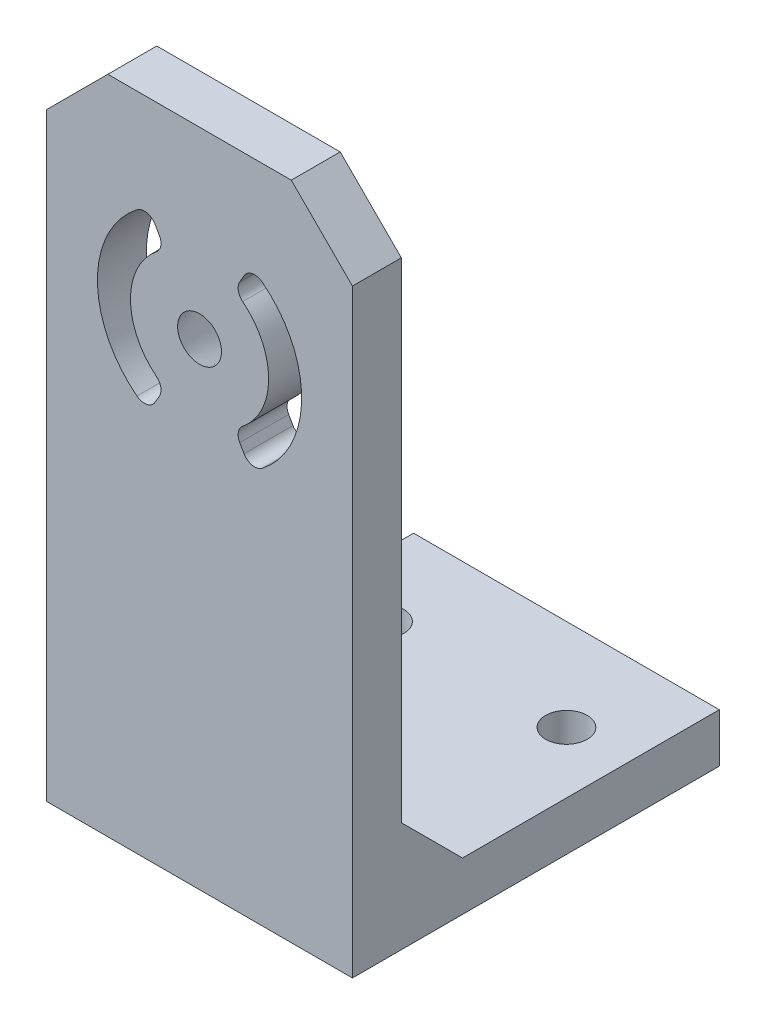
ISO-10303-21;
HEADER;
FILE_DESCRIPTION(('STEP AP214'),'2;1');
FILE_NAME('part.step','',(''),(''),'','','');
FILE_SCHEMA(('AUTOMOTIVE_DESIGN { 1 0 10303 214 1 1 1 1 }'));
ENDSEC;
DATA;
#1=APPLICATION_CONTEXT('core data for automotive mechanical design processes');
#2=APPLICATION_PROTOCOL_DEFINITION('international standard','automotive_design',2000,#1);
#3=PRODUCT_CONTEXT('',#1,'mechanical');
#4=PRODUCT('Part','Part','',(#3));
#5=PRODUCT_RELATED_PRODUCT_CATEGORY('part','',(#4));
#6=PRODUCT_DEFINITION_FORMATION('','',#4);
#7=PRODUCT_DEFINITION_CONTEXT('part definition',#1,'design');
#8=PRODUCT_DEFINITION('design','',#6,#7);
#9=PRODUCT_DEFINITION_SHAPE('','',#8);
#10=(LENGTH_UNIT() NAMED_UNIT(*) SI_UNIT(.MILLI.,.METRE.));
#11=(NAMED_UNIT(*) PLANE_ANGLE_UNIT() SI_UNIT($,.RADIAN.));
#12=(NAMED_UNIT(*) SI_UNIT($,.STERADIAN.) SOLID_ANGLE_UNIT());
#13=UNCERTAINTY_MEASURE_WITH_UNIT(LENGTH_MEASURE(1.E-05),#10,'distance_accuracy_value','');
#14=(GEOMETRIC_REPRESENTATION_CONTEXT(3) GLOBAL_UNCERTAINTY_ASSIGNED_CONTEXT((#13)) GLOBAL_UNIT_ASSIGNED_CONTEXT((#10,
#11,#12)) REPRESENTATION_CONTEXT('',''));
#15=CARTESIAN_POINT('',(0.,0.,0.));
#16=DIRECTION('',(0.,0.,1.));
#17=DIRECTION('',(1.,0.,0.));
#18=AXIS2_PLACEMENT_3D('',#15,#16,#17);
#19=CARTESIAN_POINT('',(0.,4.,0.));
#20=DIRECTION('',(0.,-1.,0.));
#21=DIRECTION('',(0.,0.,-1.));
#22=AXIS2_PLACEMENT_3D('',#19,#20,#21);
#23=PLANE('',#22);
#24=CARTESIAN_POINT('',(20.,4.,-22.5));
#25=DIRECTION('',(0.,1.,0.));
#26=DIRECTION('',(0.,0.,1.));
#27=AXIS2_PLACEMENT_3D('',#24,#25,#26);
#28=CIRCLE('',#27,1.7);
#29=CARTESIAN_POINT('',(20.,4.,-20.8));
#30=VERTEX_POINT('',#29);
#31=EDGE_CURVE('E457',#30,#30,#28,.T.);
#32=ORIENTED_EDGE('',*,*,#31,.F.);
#33=EDGE_LOOP('',(#32));
#34=FACE_BOUND('',#33,.T.);
#35=CARTESIAN_POINT('',(5.,4.,-22.5));
#36=DIRECTION('',(0.,1.,0.));
#37=DIRECTION('',(0.,0.,1.));
#38=AXIS2_PLACEMENT_3D('',#35,#36,#37);
#39=CIRCLE('',#38,1.7);
#40=CARTESIAN_POINT('',(5.,4.,-20.8));
#41=VERTEX_POINT('',#40);
#42=EDGE_CURVE('E253',#41,#41,#39,.T.);
#43=ORIENTED_EDGE('',*,*,#42,.F.);
#44=EDGE_LOOP('',(#43));
#45=FACE_BOUND('',#44,.T.);
#46=DIRECTION('',(0.,0.,1.));
#47=VECTOR('',#46,1.);
#48=CARTESIAN_POINT('',(0.,4.,0.));
#49=LINE('',#48,#47);
#50=CARTESIAN_POINT('',(0.,4.,-30.));
#51=VERTEX_POINT('',#50);
#52=CARTESIAN_POINT('',(0.,4.,-9.));
#53=VERTEX_POINT('',#52);
#54=EDGE_CURVE('E225',#51,#53,#49,.T.);
#55=ORIENTED_EDGE('',*,*,#54,.T.);
#56=DIRECTION('',(-1.,0.,0.));
#57=VECTOR('',#56,1.);
#58=CARTESIAN_POINT('',(32.0710678118655,4.,-9.));
#59=LINE('',#58,#57);
#60=CARTESIAN_POINT('',(25.,4.,-9.));
#61=VERTEX_POINT('',#60);
#62=EDGE_CURVE('E220',#61,#53,#59,.T.);
#63=ORIENTED_EDGE('',*,*,#62,.F.);
#64=DIRECTION('',(0.,0.,-1.));
#65=VECTOR('',#64,1.);
#66=CARTESIAN_POINT('',(25.,4.,0.));
#67=LINE('',#66,#65);
#68=CARTESIAN_POINT('',(25.,4.,-30.));
#69=VERTEX_POINT('',#68);
#70=EDGE_CURVE('E214',#61,#69,#67,.T.);
#71=ORIENTED_EDGE('',*,*,#70,.T.);
#72=DIRECTION('',(-1.,0.,0.));
#73=VECTOR('',#72,1.);
#74=CARTESIAN_POINT('',(0.,4.,-30.));
#75=LINE('',#74,#73);
#76=EDGE_CURVE('E217',#69,#51,#75,.T.);
#77=ORIENTED_EDGE('',*,*,#76,.T.);
#78=EDGE_LOOP('',(#55,#63,#71,#77));
#79=FACE_BOUND('',#78,.T.);
#80=ADVANCED_FACE('F47',(#34,#45,#79),#23,.F.);
#81=CARTESIAN_POINT('',(0.,0.,0.));
#82=DIRECTION('',(0.,-1.,0.));
#83=DIRECTION('',(0.,0.,-1.));
#84=AXIS2_PLACEMENT_3D('',#81,#82,#83);
#85=PLANE('',#84);
#86=CARTESIAN_POINT('',(5.,0.,-22.5));
#87=DIRECTION('',(0.,1.,0.));
#88=DIRECTION('',(0.,0.,1.));
#89=AXIS2_PLACEMENT_3D('',#86,#87,#88);
#90=CIRCLE('',#89,1.7);
#91=CARTESIAN_POINT('',(5.,0.,-20.8));
#92=VERTEX_POINT('',#91);
#93=EDGE_CURVE('E461',#92,#92,#90,.T.);
#94=ORIENTED_EDGE('',*,*,#93,.T.);
#95=EDGE_LOOP('',(#94));
#96=FACE_BOUND('',#95,.T.);
#97=DIRECTION('',(0.,0.,1.));
#98=VECTOR('',#97,1.);
#99=CARTESIAN_POINT('',(0.,0.,0.));
#100=LINE('',#99,#98);
#101=CARTESIAN_POINT('',(0.,0.,-30.));
#102=VERTEX_POINT('',#101);
#103=CARTESIAN_POINT('',(0.,0.,0.));
#104=VERTEX_POINT('',#103);
#105=EDGE_CURVE('E248',#102,#104,#100,.T.);
#106=ORIENTED_EDGE('',*,*,#105,.F.);
#107=DIRECTION('',(-1.,0.,0.));
#108=VECTOR('',#107,1.);
#109=CARTESIAN_POINT('',(0.,0.,-30.));
#110=LINE('',#109,#108);
#111=CARTESIAN_POINT('',(25.,0.,-30.));
#112=VERTEX_POINT('',#111);
#113=EDGE_CURVE('E259',#112,#102,#110,.T.);
#114=ORIENTED_EDGE('',*,*,#113,.F.);
#115=DIRECTION('',(0.,0.,-1.));
#116=VECTOR('',#115,1.);
#117=CARTESIAN_POINT('',(25.,0.,0.));
#118=LINE('',#117,#116);
#119=CARTESIAN_POINT('',(25.,0.,0.));
#120=VERTEX_POINT('',#119);
#121=EDGE_CURVE('E232',#120,#112,#118,.T.);
#122=ORIENTED_EDGE('',*,*,#121,.F.);
#123=DIRECTION('',(1.,0.,0.));
#124=VECTOR('',#123,1.);
#125=CARTESIAN_POINT('',(0.,0.,0.));
#126=LINE('',#125,#124);
#127=EDGE_CURVE('E252',#104,#120,#126,.T.);
#128=ORIENTED_EDGE('',*,*,#127,.F.);
#129=EDGE_LOOP('',(#106,#114,#122,#128));
#130=FACE_BOUND('',#129,.T.);
#131=CARTESIAN_POINT('',(20.,0.,-22.5));
#132=DIRECTION('',(0.,1.,0.));
#133=DIRECTION('',(0.,0.,1.));
#134=AXIS2_PLACEMENT_3D('',#131,#132,#133);
#135=CIRCLE('',#134,1.7);
#136=CARTESIAN_POINT('',(20.,0.,-20.8));
#137=VERTEX_POINT('',#136);
#138=EDGE_CURVE('E456',#137,#137,#135,.T.);
#139=ORIENTED_EDGE('',*,*,#138,.T.);
#140=EDGE_LOOP('',(#139));
#141=FACE_BOUND('',#140,.T.);
#142=ADVANCED_FACE('F555',(#96,#130,#141),#85,.T.);
#143=CARTESIAN_POINT('',(0.,4.,0.));
#144=DIRECTION('',(1.,0.,0.));
#145=DIRECTION('',(0.,0.,-1.));
#146=AXIS2_PLACEMENT_3D('',#143,#144,#145);
#147=PLANE('',#146);
#148=DIRECTION('',(0.,-1.,0.));
#149=VECTOR('',#148,1.);
#150=CARTESIAN_POINT('',(0.,4.,0.));
#151=LINE('',#150,#149);
#152=CARTESIAN_POINT('',(0.,49.,0.));
#153=VERTEX_POINT('',#152);
#154=EDGE_CURVE('E264',#153,#104,#151,.T.);
#155=ORIENTED_EDGE('',*,*,#154,.F.);
#156=DIRECTION('',(0.,0.,-1.));
#157=VECTOR('',#156,1.);
#158=CARTESIAN_POINT('',(0.,49.,0.));
#159=LINE('',#158,#157);
#160=CARTESIAN_POINT('',(0.,49.,-4.));
#161=VERTEX_POINT('',#160);
#162=EDGE_CURVE('E290',#153,#161,#159,.T.);
#163=ORIENTED_EDGE('',*,*,#162,.T.);
#164=DIRECTION('',(0.,-1.,0.));
#165=VECTOR('',#164,1.);
#166=CARTESIAN_POINT('',(0.,54.,-4.));
#167=LINE('',#166,#165);
#168=CARTESIAN_POINT('',(0.,9.,-4.));
#169=VERTEX_POINT('',#168);
#170=EDGE_CURVE('E450',#161,#169,#167,.T.);
#171=ORIENTED_EDGE('',*,*,#170,.T.);
#172=DIRECTION('',(0.,-0.707106781186548,-0.707106781186547));
#173=VECTOR('',#172,1.);
#174=CARTESIAN_POINT('',(0.,9.,-4.));
#175=LINE('',#174,#173);
#176=EDGE_CURVE('E477',#169,#53,#175,.T.);
#177=ORIENTED_EDGE('',*,*,#176,.T.);
#178=ORIENTED_EDGE('',*,*,#54,.F.);
#179=DIRECTION('',(0.,-1.,0.));
#180=VECTOR('',#179,1.);
#181=CARTESIAN_POINT('',(0.,4.,-30.));
#182=LINE('',#181,#180);
#183=EDGE_CURVE('E237',#51,#102,#182,.T.);
#184=ORIENTED_EDGE('',*,*,#183,.T.);
#185=ORIENTED_EDGE('',*,*,#105,.T.);
#186=EDGE_LOOP('',(#155,#163,#171,#177,#178,#184,#185));
#187=FACE_BOUND('',#186,.T.);
#188=ADVANCED_FACE('F481',(#187),#147,.F.);
#189=CARTESIAN_POINT('',(0.,4.,0.));
#190=DIRECTION('',(0.,0.,-1.));
#191=DIRECTION('',(-1.,0.,0.));
#192=AXIS2_PLACEMENT_3D('',#189,#190,#191);
#193=PLANE('',#192);
#194=CARTESIAN_POINT('',(12.5,39.,0.));
#195=DIRECTION('',(0.,0.,-1.));
#196=DIRECTION('',(1.,0.,0.));
#197=AXIS2_PLACEMENT_3D('',#194,#195,#196);
#198=CIRCLE('',#197,8.35);
#199=CARTESIAN_POINT('',(7.37996981241468,32.4039564223533,0.));
#200=VERTEX_POINT('',#199);
#201=CARTESIAN_POINT('',(7.37996981241473,45.5960435776468,0.));
#202=VERTEX_POINT('',#201);
#203=EDGE_CURVE('E498',#200,#202,#198,.T.);
#204=ORIENTED_EDGE('',*,*,#203,.T.);
#205=CARTESIAN_POINT('',(7.99314708038901,44.8060982390065,0.));
#206=DIRECTION('',(0.,0.,-1.));
#207=DIRECTION('',(-1.,0.,0.));
#208=AXIS2_PLACEMENT_3D('',#205,#206,#207);
#209=CIRCLE('',#208,1.);
#210=CARTESIAN_POINT('',(8.85917248417345,45.3060982390065,0.));
#211=VERTEX_POINT('',#210);
#212=EDGE_CURVE('E351',#202,#211,#209,.T.);
#213=ORIENTED_EDGE('',*,*,#212,.T.);
#214=DIRECTION('',(0.499999999999995,-0.866025403784441,0.));
#215=VECTOR('',#214,1.);
#216=CARTESIAN_POINT('',(9.67500000000003,43.8930435313821,0.));
#217=LINE('',#216,#215);
#218=CARTESIAN_POINT('',(9.21280894987837,44.6935819129965,0.));
#219=VERTEX_POINT('',#218);
#220=EDGE_CURVE('E438',#211,#219,#217,.T.);
#221=ORIENTED_EDGE('',*,*,#220,.T.);
#222=CARTESIAN_POINT('',(8.34678354609393,44.1935819129965,0.));
#223=DIRECTION('',(0.,0.,-1.));
#224=DIRECTION('',(-1.,0.,0.));
#225=AXIS2_PLACEMENT_3D('',#222,#223,#224);
#226=CIRCLE('',#225,1.);
#227=CARTESIAN_POINT('',(8.97132737374898,43.4125921516436,0.));
#228=VERTEX_POINT('',#227);
#229=EDGE_CURVE('E357',#219,#228,#226,.T.);
#230=ORIENTED_EDGE('',*,*,#229,.T.);
#231=CARTESIAN_POINT('',(12.5,39.,0.));
#232=DIRECTION('',(0.,0.,1.));
#233=DIRECTION('',(1.,0.,0.));
#234=AXIS2_PLACEMENT_3D('',#231,#232,#233);
#235=CIRCLE('',#234,5.65);
#236=CARTESIAN_POINT('',(8.97132737374894,34.5874078483564,0.));
#237=VERTEX_POINT('',#236);
#238=EDGE_CURVE('E489',#228,#237,#235,.T.);
#239=ORIENTED_EDGE('',*,*,#238,.T.);
#240=CARTESIAN_POINT('',(8.34678354609388,33.8064180870036,0.));
#241=DIRECTION('',(0.,0.,-1.));
#242=DIRECTION('',(-1.,0.,0.));
#243=AXIS2_PLACEMENT_3D('',#240,#241,#242);
#244=CIRCLE('',#243,1.);
#245=CARTESIAN_POINT('',(9.21280894987832,33.3064180870036,0.));
#246=VERTEX_POINT('',#245);
#247=EDGE_CURVE('E369',#237,#246,#244,.T.);
#248=ORIENTED_EDGE('',*,*,#247,.T.);
#249=DIRECTION('',(-0.5,-0.866025403784439,0.));
#250=VECTOR('',#249,1.);
#251=CARTESIAN_POINT('',(8.32499999999999,31.7686878784,0.));
#252=LINE('',#251,#250);
#253=CARTESIAN_POINT('',(8.8591724841734,32.6939017609936,0.));
#254=VERTEX_POINT('',#253);
#255=EDGE_CURVE('E493',#246,#254,#252,.T.);
#256=ORIENTED_EDGE('',*,*,#255,.T.);
#257=CARTESIAN_POINT('',(7.99314708038897,33.1939017609936,0.));
#258=DIRECTION('',(0.,0.,-1.));
#259=DIRECTION('',(-1.,0.,0.));
#260=AXIS2_PLACEMENT_3D('',#257,#258,#259);
#261=CIRCLE('',#260,1.);
#262=EDGE_CURVE('E363',#254,#200,#261,.T.);
#263=ORIENTED_EDGE('',*,*,#262,.T.);
#264=EDGE_LOOP('',(#204,#213,#221,#230,#239,#248,#256,#263));
#265=FACE_BOUND('',#264,.T.);
#266=CARTESIAN_POINT('',(12.5,39.,0.));
#267=DIRECTION('',(0.,0.,1.));
#268=DIRECTION('',(-1.,0.,0.));
#269=AXIS2_PLACEMENT_3D('',#266,#267,#268);
#270=CIRCLE('',#269,5.65);
#271=CARTESIAN_POINT('',(16.0286726262511,34.5874078483564,0.));
#272=VERTEX_POINT('',#271);
#273=CARTESIAN_POINT('',(16.028672626251,43.4125921516436,0.));
#274=VERTEX_POINT('',#273);
#275=EDGE_CURVE('E413',#272,#274,#270,.T.);
#276=ORIENTED_EDGE('',*,*,#275,.T.);
#277=CARTESIAN_POINT('',(16.6532164539061,44.1935819129965,0.));
#278=DIRECTION('',(0.,0.,-1.));
#279=DIRECTION('',(-1.,0.,0.));
#280=AXIS2_PLACEMENT_3D('',#277,#278,#279);
#281=CIRCLE('',#280,1.);
#282=CARTESIAN_POINT('',(15.7871910501216,44.6935819129964,0.));
#283=VERTEX_POINT('',#282);
#284=EDGE_CURVE('E11',#274,#283,#281,.T.);
#285=ORIENTED_EDGE('',*,*,#284,.T.);
#286=DIRECTION('',(0.499999999999996,0.866025403784441,0.));
#287=VECTOR('',#286,1.);
#288=CARTESIAN_POINT('',(16.675,46.2313121216001,0.));
#289=LINE('',#288,#287);
#290=CARTESIAN_POINT('',(16.1408275158266,45.3060982390065,0.));
#291=VERTEX_POINT('',#290);
#292=EDGE_CURVE('E410',#283,#291,#289,.T.);
#293=ORIENTED_EDGE('',*,*,#292,.T.);
#294=CARTESIAN_POINT('',(17.006852919611,44.8060982390065,0.));
#295=DIRECTION('',(0.,0.,-1.));
#296=DIRECTION('',(-1.,0.,0.));
#297=AXIS2_PLACEMENT_3D('',#294,#295,#296);
#298=CIRCLE('',#297,1.);
#299=CARTESIAN_POINT('',(17.6200301875853,45.5960435776468,0.));
#300=VERTEX_POINT('',#299);
#301=EDGE_CURVE('E387',#291,#300,#298,.T.);
#302=ORIENTED_EDGE('',*,*,#301,.T.);
#303=CARTESIAN_POINT('',(12.5,39.,0.));
#304=DIRECTION('',(0.,0.,-1.));
#305=DIRECTION('',(-1.,0.,0.));
#306=AXIS2_PLACEMENT_3D('',#303,#304,#305);
#307=CIRCLE('',#306,8.35);
#308=CARTESIAN_POINT('',(17.6200301875853,32.4039564223532,0.));
#309=VERTEX_POINT('',#308);
#310=EDGE_CURVE('E429',#300,#309,#307,.T.);
#311=ORIENTED_EDGE('',*,*,#310,.T.);
#312=CARTESIAN_POINT('',(17.006852919611,33.1939017609936,0.));
#313=DIRECTION('',(0.,0.,-1.));
#314=DIRECTION('',(-1.,0.,0.));
#315=AXIS2_PLACEMENT_3D('',#312,#313,#314);
#316=CIRCLE('',#315,1.);
#317=CARTESIAN_POINT('',(16.1408275158266,32.6939017609936,0.));
#318=VERTEX_POINT('',#317);
#319=EDGE_CURVE('E375',#309,#318,#316,.T.);
#320=ORIENTED_EDGE('',*,*,#319,.T.);
#321=DIRECTION('',(-0.5,0.866025403784438,0.));
#322=VECTOR('',#321,1.);
#323=CARTESIAN_POINT('',(15.325,34.1069564686179,0.));
#324=LINE('',#323,#322);
#325=CARTESIAN_POINT('',(15.7871910501217,33.3064180870036,0.));
#326=VERTEX_POINT('',#325);
#327=EDGE_CURVE('E418',#318,#326,#324,.T.);
#328=ORIENTED_EDGE('',*,*,#327,.T.);
#329=CARTESIAN_POINT('',(16.6532164539061,33.8064180870036,0.));
#330=DIRECTION('',(0.,0.,-1.));
#331=DIRECTION('',(-1.,0.,0.));
#332=AXIS2_PLACEMENT_3D('',#329,#330,#331);
#333=CIRCLE('',#332,1.);
#334=EDGE_CURVE('E381',#326,#272,#333,.T.);
#335=ORIENTED_EDGE('',*,*,#334,.T.);
#336=EDGE_LOOP('',(#276,#285,#293,#302,#311,#320,#328,#335));
#337=FACE_BOUND('',#336,.T.);
#338=CARTESIAN_POINT('',(12.5,39.,0.));
#339=DIRECTION('',(0.,0.,-1.));
#340=DIRECTION('',(-1.,0.,0.));
#341=AXIS2_PLACEMENT_3D('',#338,#339,#340);
#342=CIRCLE('',#341,1.79411906293519);
#343=CARTESIAN_POINT('',(10.7058809370648,39.,0.));
#344=VERTEX_POINT('',#343);
#345=EDGE_CURVE('E437',#344,#344,#342,.T.);
#346=ORIENTED_EDGE('',*,*,#345,.T.);
#347=EDGE_LOOP('',(#346));
#348=FACE_BOUND('',#347,.T.);
#349=DIRECTION('',(0.,-1.,0.));
#350=VECTOR('',#349,1.);
#351=CARTESIAN_POINT('',(25.,4.,0.));
#352=LINE('',#351,#350);
#353=CARTESIAN_POINT('',(25.,49.,0.));
#354=VERTEX_POINT('',#353);
#355=EDGE_CURVE('E236',#354,#120,#352,.T.);
#356=ORIENTED_EDGE('',*,*,#355,.F.);
#357=DIRECTION('',(0.707106781186547,-0.707106781186549,0.));
#358=VECTOR('',#357,1.);
#359=CARTESIAN_POINT('',(20.,54.,0.));
#360=LINE('',#359,#358);
#361=CARTESIAN_POINT('',(20.,54.,0.));
#362=VERTEX_POINT('',#361);
#363=EDGE_CURVE('E287',#354,#362,#360,.F.);
#364=ORIENTED_EDGE('',*,*,#363,.T.);
#365=DIRECTION('',(1.,0.,0.));
#366=VECTOR('',#365,1.);
#367=CARTESIAN_POINT('',(0.,54.,0.));
#368=LINE('',#367,#366);
#369=CARTESIAN_POINT('',(5.,54.,0.));
#370=VERTEX_POINT('',#369);
#371=EDGE_CURVE('E442',#370,#362,#368,.T.);
#372=ORIENTED_EDGE('',*,*,#371,.F.);
#373=DIRECTION('',(0.707106781186547,0.707106781186549,0.));
#374=VECTOR('',#373,1.);
#375=CARTESIAN_POINT('',(5.,54.,0.));
#376=LINE('',#375,#374);
#377=EDGE_CURVE('E284',#370,#153,#376,.F.);
#378=ORIENTED_EDGE('',*,*,#377,.T.);
#379=ORIENTED_EDGE('',*,*,#154,.T.);
#380=ORIENTED_EDGE('',*,*,#127,.T.);
#381=EDGE_LOOP('',(#356,#364,#372,#378,#379,#380));
#382=FACE_BOUND('',#381,.T.);
#383=ADVANCED_FACE('F538',(#265,#337,#348,#382),#193,.F.);
#384=CARTESIAN_POINT('',(25.,4.,0.));
#385=DIRECTION('',(-1.,0.,0.));
#386=DIRECTION('',(0.,0.,1.));
#387=AXIS2_PLACEMENT_3D('',#384,#385,#386);
#388=PLANE('',#387);
#389=DIRECTION('',(0.,-1.,0.));
#390=VECTOR('',#389,1.);
#391=CARTESIAN_POINT('',(25.,54.,-4.));
#392=LINE('',#391,#390);
#393=CARTESIAN_POINT('',(25.,49.,-4.));
#394=VERTEX_POINT('',#393);
#395=CARTESIAN_POINT('',(25.,9.,-4.));
#396=VERTEX_POINT('',#395);
#397=EDGE_CURVE('E453',#394,#396,#392,.T.);
#398=ORIENTED_EDGE('',*,*,#397,.F.);
#399=DIRECTION('',(0.,0.,1.));
#400=VECTOR('',#399,1.);
#401=CARTESIAN_POINT('',(25.,49.,0.));
#402=LINE('',#401,#400);
#403=EDGE_CURVE('E281',#394,#354,#402,.T.);
#404=ORIENTED_EDGE('',*,*,#403,.T.);
#405=ORIENTED_EDGE('',*,*,#355,.T.);
#406=ORIENTED_EDGE('',*,*,#121,.T.);
#407=DIRECTION('',(0.,-1.,0.));
#408=VECTOR('',#407,1.);
#409=CARTESIAN_POINT('',(25.,4.,-30.));
#410=LINE('',#409,#408);
#411=EDGE_CURVE('E228',#69,#112,#410,.T.);
#412=ORIENTED_EDGE('',*,*,#411,.F.);
#413=ORIENTED_EDGE('',*,*,#70,.F.);
#414=DIRECTION('',(0.,0.707106781186548,0.707106781186547));
#415=VECTOR('',#414,1.);
#416=CARTESIAN_POINT('',(25.,9.,-4.));
#417=LINE('',#416,#415);
#418=EDGE_CURVE('E414',#61,#396,#417,.T.);
#419=ORIENTED_EDGE('',*,*,#418,.T.);
#420=EDGE_LOOP('',(#398,#404,#405,#406,#412,#413,#419));
#421=FACE_BOUND('',#420,.T.);
#422=ADVANCED_FACE('F230',(#421),#388,.F.);
#423=CARTESIAN_POINT('',(0.,4.,-30.));
#424=DIRECTION('',(0.,0.,1.));
#425=DIRECTION('',(1.,0.,0.));
#426=AXIS2_PLACEMENT_3D('',#423,#424,#425);
#427=PLANE('',#426);
#428=ORIENTED_EDGE('',*,*,#113,.T.);
#429=ORIENTED_EDGE('',*,*,#183,.F.);
#430=ORIENTED_EDGE('',*,*,#76,.F.);
#431=ORIENTED_EDGE('',*,*,#411,.T.);
#432=EDGE_LOOP('',(#428,#429,#430,#431));
#433=FACE_BOUND('',#432,.T.);
#434=ADVANCED_FACE('F239',(#433),#427,.F.);
#435=CARTESIAN_POINT('',(5.,4.,-22.5));
#436=DIRECTION('',(0.,-1.,0.));
#437=DIRECTION('',(0.,0.,-1.));
#438=AXIS2_PLACEMENT_3D('',#435,#436,#437);
#439=CYLINDRICAL_SURFACE('',#438,1.7);
#440=ORIENTED_EDGE('',*,*,#42,.T.);
#441=EDGE_LOOP('',(#440));
#442=FACE_BOUND('',#441,.T.);
#443=ORIENTED_EDGE('',*,*,#93,.F.);
#444=EDGE_LOOP('',(#443));
#445=FACE_BOUND('',#444,.T.);
#446=ADVANCED_FACE('F568',(#442,#445),#439,.F.);
#447=CARTESIAN_POINT('',(20.,4.,-22.5));
#448=DIRECTION('',(0.,-1.,0.));
#449=DIRECTION('',(0.,0.,-1.));
#450=AXIS2_PLACEMENT_3D('',#447,#448,#449);
#451=CYLINDRICAL_SURFACE('',#450,1.7);
#452=ORIENTED_EDGE('',*,*,#31,.T.);
#453=EDGE_LOOP('',(#452));
#454=FACE_BOUND('',#453,.T.);
#455=ORIENTED_EDGE('',*,*,#138,.F.);
#456=EDGE_LOOP('',(#455));
#457=FACE_BOUND('',#456,.T.);
#458=ADVANCED_FACE('F641',(#454,#457),#451,.F.);
#459=CARTESIAN_POINT('',(0.,54.,-4.));
#460=DIRECTION('',(0.,0.,1.));
#461=DIRECTION('',(1.,0.,0.));
#462=AXIS2_PLACEMENT_3D('',#459,#460,#461);
#463=PLANE('',#462);
#464=DIRECTION('',(-0.5,-0.866025403784439,0.));
#465=VECTOR('',#464,1.);
#466=CARTESIAN_POINT('',(8.32499999999999,31.7686878784,-4.));
#467=LINE('',#466,#465);
#468=CARTESIAN_POINT('',(9.21280894987832,33.3064180870036,-4.));
#469=VERTEX_POINT('',#468);
#470=CARTESIAN_POINT('',(8.8591724841734,32.6939017609936,-4.));
#471=VERTEX_POINT('',#470);
#472=EDGE_CURVE('E509',#469,#471,#467,.T.);
#473=ORIENTED_EDGE('',*,*,#472,.F.);
#474=CARTESIAN_POINT('',(8.34678354609388,33.8064180870036,-4.));
#475=DIRECTION('',(0.,0.,1.));
#476=DIRECTION('',(1.,0.,0.));
#477=AXIS2_PLACEMENT_3D('',#474,#475,#476);
#478=CIRCLE('',#477,1.);
#479=CARTESIAN_POINT('',(8.97132737374894,34.5874078483564,-4.));
#480=VERTEX_POINT('',#479);
#481=EDGE_CURVE('E366',#469,#480,#478,.T.);
#482=ORIENTED_EDGE('',*,*,#481,.T.);
#483=CARTESIAN_POINT('',(12.5,39.,-4.));
#484=DIRECTION('',(0.,0.,1.));
#485=DIRECTION('',(1.,0.,0.));
#486=AXIS2_PLACEMENT_3D('',#483,#484,#485);
#487=CIRCLE('',#486,5.65);
#488=CARTESIAN_POINT('',(8.97132737374898,43.4125921516436,-4.));
#489=VERTEX_POINT('',#488);
#490=EDGE_CURVE('E505',#489,#480,#487,.T.);
#491=ORIENTED_EDGE('',*,*,#490,.F.);
#492=CARTESIAN_POINT('',(8.34678354609393,44.1935819129965,-4.));
#493=DIRECTION('',(0.,0.,1.));
#494=DIRECTION('',(1.,0.,0.));
#495=AXIS2_PLACEMENT_3D('',#492,#493,#494);
#496=CIRCLE('',#495,1.);
#497=CARTESIAN_POINT('',(9.21280894987837,44.6935819129965,-4.));
#498=VERTEX_POINT('',#497);
#499=EDGE_CURVE('E354',#489,#498,#496,.T.);
#500=ORIENTED_EDGE('',*,*,#499,.T.);
#501=DIRECTION('',(0.499999999999995,-0.866025403784441,0.));
#502=VECTOR('',#501,1.);
#503=CARTESIAN_POINT('',(9.67500000000003,43.8930435313821,-4.));
#504=LINE('',#503,#502);
#505=CARTESIAN_POINT('',(8.85917248417345,45.3060982390065,-4.));
#506=VERTEX_POINT('',#505);
#507=EDGE_CURVE('E494',#506,#498,#504,.T.);
#508=ORIENTED_EDGE('',*,*,#507,.F.);
#509=CARTESIAN_POINT('',(7.99314708038901,44.8060982390065,-4.));
#510=DIRECTION('',(0.,0.,1.));
#511=DIRECTION('',(1.,0.,0.));
#512=AXIS2_PLACEMENT_3D('',#509,#510,#511);
#513=CIRCLE('',#512,1.);
#514=CARTESIAN_POINT('',(7.37996981241473,45.5960435776468,-4.));
#515=VERTEX_POINT('',#514);
#516=EDGE_CURVE('E348',#506,#515,#513,.T.);
#517=ORIENTED_EDGE('',*,*,#516,.T.);
#518=CARTESIAN_POINT('',(12.5,39.,-4.));
#519=DIRECTION('',(0.,0.,-1.));
#520=DIRECTION('',(1.,0.,0.));
#521=AXIS2_PLACEMENT_3D('',#518,#519,#520);
#522=CIRCLE('',#521,8.35);
#523=CARTESIAN_POINT('',(7.37996981241468,32.4039564223533,-4.));
#524=VERTEX_POINT('',#523);
#525=EDGE_CURVE('E513',#524,#515,#522,.T.);
#526=ORIENTED_EDGE('',*,*,#525,.F.);
#527=CARTESIAN_POINT('',(7.99314708038897,33.1939017609936,-4.));
#528=DIRECTION('',(0.,0.,1.));
#529=DIRECTION('',(1.,0.,0.));
#530=AXIS2_PLACEMENT_3D('',#527,#528,#529);
#531=CIRCLE('',#530,1.);
#532=EDGE_CURVE('E360',#524,#471,#531,.T.);
#533=ORIENTED_EDGE('',*,*,#532,.T.);
#534=EDGE_LOOP('',(#473,#482,#491,#500,#508,#517,#526,#533));
#535=FACE_BOUND('',#534,.T.);
#536=DIRECTION('',(-0.5,0.866025403784438,0.));
#537=VECTOR('',#536,1.);
#538=CARTESIAN_POINT('',(15.325,34.1069564686179,-4.));
#539=LINE('',#538,#537);
#540=CARTESIAN_POINT('',(16.1408275158266,32.6939017609936,-4.));
#541=VERTEX_POINT('',#540);
#542=CARTESIAN_POINT('',(15.7871910501217,33.3064180870036,-4.));
#543=VERTEX_POINT('',#542);
#544=EDGE_CURVE('E407',#541,#543,#539,.T.);
#545=ORIENTED_EDGE('',*,*,#544,.F.);
#546=CARTESIAN_POINT('',(17.006852919611,33.1939017609936,-4.));
#547=DIRECTION('',(0.,0.,1.));
#548=DIRECTION('',(1.,0.,0.));
#549=AXIS2_PLACEMENT_3D('',#546,#547,#548);
#550=CIRCLE('',#549,1.);
#551=CARTESIAN_POINT('',(17.6200301875853,32.4039564223532,-4.));
#552=VERTEX_POINT('',#551);
#553=EDGE_CURVE('E372',#541,#552,#550,.T.);
#554=ORIENTED_EDGE('',*,*,#553,.T.);
#555=CARTESIAN_POINT('',(12.5,39.,-4.));
#556=DIRECTION('',(0.,0.,-1.));
#557=DIRECTION('',(-1.,0.,0.));
#558=AXIS2_PLACEMENT_3D('',#555,#556,#557);
#559=CIRCLE('',#558,8.35);
#560=CARTESIAN_POINT('',(17.6200301875853,45.5960435776468,-4.));
#561=VERTEX_POINT('',#560);
#562=EDGE_CURVE('E423',#561,#552,#559,.T.);
#563=ORIENTED_EDGE('',*,*,#562,.F.);
#564=CARTESIAN_POINT('',(17.006852919611,44.8060982390065,-4.));
#565=DIRECTION('',(0.,0.,1.));
#566=DIRECTION('',(1.,0.,0.));
#567=AXIS2_PLACEMENT_3D('',#564,#565,#566);
#568=CIRCLE('',#567,1.);
#569=CARTESIAN_POINT('',(16.1408275158266,45.3060982390065,-4.));
#570=VERTEX_POINT('',#569);
#571=EDGE_CURVE('E384',#561,#570,#568,.T.);
#572=ORIENTED_EDGE('',*,*,#571,.T.);
#573=DIRECTION('',(0.499999999999996,0.866025403784441,0.));
#574=VECTOR('',#573,1.);
#575=CARTESIAN_POINT('',(16.675,46.2313121216001,-4.));
#576=LINE('',#575,#574);
#577=CARTESIAN_POINT('',(15.7871910501216,44.6935819129964,-4.));
#578=VERTEX_POINT('',#577);
#579=EDGE_CURVE('E398',#578,#570,#576,.T.);
#580=ORIENTED_EDGE('',*,*,#579,.F.);
#581=CARTESIAN_POINT('',(16.6532164539061,44.1935819129965,-4.));
#582=DIRECTION('',(0.,0.,1.));
#583=DIRECTION('',(1.,0.,0.));
#584=AXIS2_PLACEMENT_3D('',#581,#582,#583);
#585=CIRCLE('',#584,1.);
#586=CARTESIAN_POINT('',(16.028672626251,43.4125921516436,-4.));
#587=VERTEX_POINT('',#586);
#588=EDGE_CURVE('E56',#578,#587,#585,.T.);
#589=ORIENTED_EDGE('',*,*,#588,.T.);
#590=CARTESIAN_POINT('',(12.5,39.,-4.));
#591=DIRECTION('',(0.,0.,1.));
#592=DIRECTION('',(-1.,0.,0.));
#593=AXIS2_PLACEMENT_3D('',#590,#591,#592);
#594=CIRCLE('',#593,5.65);
#595=CARTESIAN_POINT('',(16.0286726262511,34.5874078483564,-4.));
#596=VERTEX_POINT('',#595);
#597=EDGE_CURVE('E397',#596,#587,#594,.T.);
#598=ORIENTED_EDGE('',*,*,#597,.F.);
#599=CARTESIAN_POINT('',(16.6532164539061,33.8064180870036,-4.));
#600=DIRECTION('',(0.,0.,1.));
#601=DIRECTION('',(1.,0.,0.));
#602=AXIS2_PLACEMENT_3D('',#599,#600,#601);
#603=CIRCLE('',#602,1.);
#604=EDGE_CURVE('E378',#596,#543,#603,.T.);
#605=ORIENTED_EDGE('',*,*,#604,.T.);
#606=EDGE_LOOP('',(#545,#554,#563,#572,#580,#589,#598,#605));
#607=FACE_BOUND('',#606,.T.);
#608=CARTESIAN_POINT('',(12.5,39.,-4.));
#609=DIRECTION('',(0.,0.,-1.));
#610=DIRECTION('',(-1.,0.,0.));
#611=AXIS2_PLACEMENT_3D('',#608,#609,#610);
#612=CIRCLE('',#611,3.25);
#613=CARTESIAN_POINT('',(9.25,39.,-4.));
#614=VERTEX_POINT('',#613);
#615=EDGE_CURVE('E433',#614,#614,#612,.T.);
#616=ORIENTED_EDGE('',*,*,#615,.F.);
#617=EDGE_LOOP('',(#616));
#618=FACE_BOUND('',#617,.T.);
#619=DIRECTION('',(-1.,0.,0.));
#620=VECTOR('',#619,1.);
#621=CARTESIAN_POINT('',(0.,54.,-4.));
#622=LINE('',#621,#620);
#623=CARTESIAN_POINT('',(20.,54.,-4.));
#624=VERTEX_POINT('',#623);
#625=CARTESIAN_POINT('',(5.,54.,-4.));
#626=VERTEX_POINT('',#625);
#627=EDGE_CURVE('E446',#624,#626,#622,.T.);
#628=ORIENTED_EDGE('',*,*,#627,.F.);
#629=DIRECTION('',(-0.707106781186547,0.707106781186549,0.));
#630=VECTOR('',#629,1.);
#631=CARTESIAN_POINT('',(20.,54.,-4.));
#632=LINE('',#631,#630);
#633=EDGE_CURVE('E278',#624,#394,#632,.F.);
#634=ORIENTED_EDGE('',*,*,#633,.T.);
#635=ORIENTED_EDGE('',*,*,#397,.T.);
#636=DIRECTION('',(-1.,0.,0.));
#637=VECTOR('',#636,1.);
#638=CARTESIAN_POINT('',(32.0710678118655,9.,-4.));
#639=LINE('',#638,#637);
#640=EDGE_CURVE('E420',#396,#169,#639,.T.);
#641=ORIENTED_EDGE('',*,*,#640,.T.);
#642=ORIENTED_EDGE('',*,*,#170,.F.);
#643=DIRECTION('',(-0.707106781186547,-0.707106781186549,0.));
#644=VECTOR('',#643,1.);
#645=CARTESIAN_POINT('',(5.,54.,-4.));
#646=LINE('',#645,#644);
#647=EDGE_CURVE('E275',#161,#626,#646,.F.);
#648=ORIENTED_EDGE('',*,*,#647,.T.);
#649=EDGE_LOOP('',(#628,#634,#635,#641,#642,#648));
#650=FACE_BOUND('',#649,.T.);
#651=ADVANCED_FACE('F395',(#535,#607,#618,#650),#463,.F.);
#652=CARTESIAN_POINT('',(0.,54.,0.));
#653=DIRECTION('',(0.,-1.,0.));
#654=DIRECTION('',(0.,0.,-1.));
#655=AXIS2_PLACEMENT_3D('',#652,#653,#654);
#656=PLANE('',#655);
#657=ORIENTED_EDGE('',*,*,#371,.T.);
#658=DIRECTION('',(0.,0.,-1.));
#659=VECTOR('',#658,1.);
#660=CARTESIAN_POINT('',(20.,54.,0.));
#661=LINE('',#660,#659);
#662=EDGE_CURVE('E271',#362,#624,#661,.T.);
#663=ORIENTED_EDGE('',*,*,#662,.T.);
#664=ORIENTED_EDGE('',*,*,#627,.T.);
#665=DIRECTION('',(0.,0.,1.));
#666=VECTOR('',#665,1.);
#667=CARTESIAN_POINT('',(5.,54.,0.));
#668=LINE('',#667,#666);
#669=EDGE_CURVE('E267',#626,#370,#668,.T.);
#670=ORIENTED_EDGE('',*,*,#669,.T.);
#671=EDGE_LOOP('',(#657,#663,#664,#670));
#672=FACE_BOUND('',#671,.T.);
#673=ADVANCED_FACE('F640',(#672),#656,.F.);
#674=CARTESIAN_POINT('',(12.5,39.,-4.));
#675=DIRECTION('',(0.,0.,-1.));
#676=DIRECTION('',(-1.,0.,0.));
#677=AXIS2_PLACEMENT_3D('',#674,#675,#676);
#678=CONICAL_SURFACE('',#677,3.25,0.349065850398867);
#679=ORIENTED_EDGE('',*,*,#345,.F.);
#680=EDGE_LOOP('',(#679));
#681=FACE_BOUND('',#680,.T.);
#682=ORIENTED_EDGE('',*,*,#615,.T.);
#683=EDGE_LOOP('',(#682));
#684=FACE_BOUND('',#683,.T.);
#685=ADVANCED_FACE('F647',(#681,#684),#678,.F.);
#686=CARTESIAN_POINT('',(12.5,39.,0.));
#687=DIRECTION('',(0.,0.,-1.));
#688=DIRECTION('',(-1.,0.,0.));
#689=AXIS2_PLACEMENT_3D('',#686,#687,#688);
#690=CYLINDRICAL_SURFACE('',#689,8.35);
#691=ORIENTED_EDGE('',*,*,#562,.T.);
#692=DIRECTION('',(0.,0.,-1.));
#693=VECTOR('',#692,1.);
#694=CARTESIAN_POINT('',(17.6200301875853,32.4039564223532,0.));
#695=LINE('',#694,#693);
#696=EDGE_CURVE('E332',#552,#309,#695,.F.);
#697=ORIENTED_EDGE('',*,*,#696,.T.);
#698=ORIENTED_EDGE('',*,*,#310,.F.);
#699=DIRECTION('',(0.,0.,-1.));
#700=VECTOR('',#699,1.);
#701=CARTESIAN_POINT('',(17.6200301875853,45.5960435776468,0.));
#702=LINE('',#701,#700);
#703=EDGE_CURVE('E328',#300,#561,#702,.T.);
#704=ORIENTED_EDGE('',*,*,#703,.T.);
#705=EDGE_LOOP('',(#691,#697,#698,#704));
#706=FACE_BOUND('',#705,.T.);
#707=ADVANCED_FACE('F530',(#706),#690,.F.);
#708=CARTESIAN_POINT('',(16.675,46.2313121216001,0.));
#709=DIRECTION('',(-0.866025403784441,0.499999999999996,0.));
#710=DIRECTION('',(-0.499999999999996,-0.866025403784441,0.));
#711=AXIS2_PLACEMENT_3D('',#708,#709,#710);
#712=PLANE('',#711);
#713=ORIENTED_EDGE('',*,*,#579,.T.);
#714=DIRECTION('',(0.,0.,1.));
#715=VECTOR('',#714,1.);
#716=CARTESIAN_POINT('',(16.1408275158266,45.3060982390065,0.));
#717=LINE('',#716,#715);
#718=EDGE_CURVE('E63',#570,#291,#717,.T.);
#719=ORIENTED_EDGE('',*,*,#718,.T.);
#720=ORIENTED_EDGE('',*,*,#292,.F.);
#721=DIRECTION('',(0.,0.,1.));
#722=VECTOR('',#721,1.);
#723=CARTESIAN_POINT('',(15.7871910501216,44.6935819129964,-4.));
#724=LINE('',#723,#722);
#725=EDGE_CURVE('E342',#283,#578,#724,.F.);
#726=ORIENTED_EDGE('',*,*,#725,.T.);
#727=EDGE_LOOP('',(#713,#719,#720,#726));
#728=FACE_BOUND('',#727,.T.);
#729=ADVANCED_FACE('F409',(#728),#712,.F.);
#730=CARTESIAN_POINT('',(12.5,39.,0.));
#731=DIRECTION('',(0.,0.,-1.));
#732=DIRECTION('',(-1.,0.,0.));
#733=AXIS2_PLACEMENT_3D('',#730,#731,#732);
#734=CYLINDRICAL_SURFACE('',#733,5.65);
#735=ORIENTED_EDGE('',*,*,#275,.F.);
#736=DIRECTION('',(0.,0.,-1.));
#737=VECTOR('',#736,1.);
#738=CARTESIAN_POINT('',(16.0286726262511,34.5874078483564,0.));
#739=LINE('',#738,#737);
#740=EDGE_CURVE('E338',#272,#596,#739,.T.);
#741=ORIENTED_EDGE('',*,*,#740,.T.);
#742=ORIENTED_EDGE('',*,*,#597,.T.);
#743=DIRECTION('',(0.,0.,-1.));
#744=VECTOR('',#743,1.);
#745=CARTESIAN_POINT('',(16.028672626251,43.4125921516436,0.));
#746=LINE('',#745,#744);
#747=EDGE_CURVE('E335',#587,#274,#746,.F.);
#748=ORIENTED_EDGE('',*,*,#747,.T.);
#749=EDGE_LOOP('',(#735,#741,#742,#748));
#750=FACE_BOUND('',#749,.T.);
#751=ADVANCED_FACE('F404',(#750),#734,.T.);
#752=CARTESIAN_POINT('',(15.325,34.1069564686179,0.));
#753=DIRECTION('',(-0.866025403784438,-0.5,0.));
#754=DIRECTION('',(0.5,-0.866025403784438,0.));
#755=AXIS2_PLACEMENT_3D('',#752,#753,#754);
#756=PLANE('',#755);
#757=ORIENTED_EDGE('',*,*,#327,.F.);
#758=DIRECTION('',(0.,0.,1.));
#759=VECTOR('',#758,1.);
#760=CARTESIAN_POINT('',(16.1408275158266,32.6939017609936,-4.));
#761=LINE('',#760,#759);
#762=EDGE_CURVE('E324',#318,#541,#761,.F.);
#763=ORIENTED_EDGE('',*,*,#762,.T.);
#764=ORIENTED_EDGE('',*,*,#544,.T.);
#765=DIRECTION('',(0.,0.,1.));
#766=VECTOR('',#765,1.);
#767=CARTESIAN_POINT('',(15.7871910501217,33.3064180870036,0.));
#768=LINE('',#767,#766);
#769=EDGE_CURVE('E321',#543,#326,#768,.T.);
#770=ORIENTED_EDGE('',*,*,#769,.T.);
#771=EDGE_LOOP('',(#757,#763,#764,#770));
#772=FACE_BOUND('',#771,.T.);
#773=ADVANCED_FACE('F541',(#772),#756,.F.);
#774=CARTESIAN_POINT('',(12.5,39.,0.));
#775=DIRECTION('',(0.,0.,-1.));
#776=DIRECTION('',(-1.,0.,0.));
#777=AXIS2_PLACEMENT_3D('',#774,#775,#776);
#778=CYLINDRICAL_SURFACE('',#777,5.65);
#779=ORIENTED_EDGE('',*,*,#238,.F.);
#780=DIRECTION('',(0.,0.,-1.));
#781=VECTOR('',#780,1.);
#782=CARTESIAN_POINT('',(8.97132737374898,43.4125921516436,0.));
#783=LINE('',#782,#781);
#784=EDGE_CURVE('E310',#228,#489,#783,.T.);
#785=ORIENTED_EDGE('',*,*,#784,.T.);
#786=ORIENTED_EDGE('',*,*,#490,.T.);
#787=DIRECTION('',(0.,0.,-1.));
#788=VECTOR('',#787,1.);
#789=CARTESIAN_POINT('',(8.97132737374894,34.5874078483564,0.));
#790=LINE('',#789,#788);
#791=EDGE_CURVE('E307',#480,#237,#790,.F.);
#792=ORIENTED_EDGE('',*,*,#791,.T.);
#793=EDGE_LOOP('',(#779,#785,#786,#792));
#794=FACE_BOUND('',#793,.T.);
#795=ADVANCED_FACE('F636',(#794),#778,.T.);
#796=CARTESIAN_POINT('',(9.67500000000003,43.8930435313821,0.));
#797=DIRECTION('',(0.866025403784441,0.499999999999995,0.));
#798=DIRECTION('',(-0.499999999999995,0.866025403784441,0.));
#799=AXIS2_PLACEMENT_3D('',#796,#797,#798);
#800=PLANE('',#799);
#801=ORIENTED_EDGE('',*,*,#220,.F.);
#802=DIRECTION('',(0.,0.,1.));
#803=VECTOR('',#802,1.);
#804=CARTESIAN_POINT('',(8.85917248417345,45.3060982390065,-4.));
#805=LINE('',#804,#803);
#806=EDGE_CURVE('E296',#211,#506,#805,.F.);
#807=ORIENTED_EDGE('',*,*,#806,.T.);
#808=ORIENTED_EDGE('',*,*,#507,.T.);
#809=DIRECTION('',(0.,0.,1.));
#810=VECTOR('',#809,1.);
#811=CARTESIAN_POINT('',(9.21280894987837,44.6935819129965,0.));
#812=LINE('',#811,#810);
#813=EDGE_CURVE('E293',#498,#219,#812,.T.);
#814=ORIENTED_EDGE('',*,*,#813,.T.);
#815=EDGE_LOOP('',(#801,#807,#808,#814));
#816=FACE_BOUND('',#815,.T.);
#817=ADVANCED_FACE('F631',(#816),#800,.F.);
#818=CARTESIAN_POINT('',(12.5,39.,0.));
#819=DIRECTION('',(0.,0.,-1.));
#820=DIRECTION('',(-1.,0.,0.));
#821=AXIS2_PLACEMENT_3D('',#818,#819,#820);
#822=CYLINDRICAL_SURFACE('',#821,8.35);
#823=ORIENTED_EDGE('',*,*,#525,.T.);
#824=DIRECTION('',(0.,0.,-1.));
#825=VECTOR('',#824,1.);
#826=CARTESIAN_POINT('',(7.37996981241473,45.5960435776468,0.));
#827=LINE('',#826,#825);
#828=EDGE_CURVE('E304',#515,#202,#827,.F.);
#829=ORIENTED_EDGE('',*,*,#828,.T.);
#830=ORIENTED_EDGE('',*,*,#203,.F.);
#831=DIRECTION('',(0.,0.,-1.));
#832=VECTOR('',#831,1.);
#833=CARTESIAN_POINT('',(7.37996981241468,32.4039564223533,0.));
#834=LINE('',#833,#832);
#835=EDGE_CURVE('E300',#200,#524,#834,.T.);
#836=ORIENTED_EDGE('',*,*,#835,.T.);
#837=EDGE_LOOP('',(#823,#829,#830,#836));
#838=FACE_BOUND('',#837,.T.);
#839=ADVANCED_FACE('F624',(#838),#822,.F.);
#840=CARTESIAN_POINT('',(8.32499999999999,31.7686878784,0.));
#841=DIRECTION('',(0.866025403784439,-0.5,0.));
#842=DIRECTION('',(0.5,0.866025403784439,0.));
#843=AXIS2_PLACEMENT_3D('',#840,#841,#842);
#844=PLANE('',#843);
#845=ORIENTED_EDGE('',*,*,#472,.T.);
#846=DIRECTION('',(0.,0.,1.));
#847=VECTOR('',#846,1.);
#848=CARTESIAN_POINT('',(8.8591724841734,32.6939017609936,0.));
#849=LINE('',#848,#847);
#850=EDGE_CURVE('E318',#471,#254,#849,.T.);
#851=ORIENTED_EDGE('',*,*,#850,.T.);
#852=ORIENTED_EDGE('',*,*,#255,.F.);
#853=DIRECTION('',(0.,0.,1.));
#854=VECTOR('',#853,1.);
#855=CARTESIAN_POINT('',(9.21280894987832,33.3064180870036,-4.));
#856=LINE('',#855,#854);
#857=EDGE_CURVE('E314',#246,#469,#856,.F.);
#858=ORIENTED_EDGE('',*,*,#857,.T.);
#859=EDGE_LOOP('',(#845,#851,#852,#858));
#860=FACE_BOUND('',#859,.T.);
#861=ADVANCED_FACE('F617',(#860),#844,.F.);
#862=CARTESIAN_POINT('',(32.0710678118655,9.,-4.));
#863=DIRECTION('',(0.,0.707106781186547,-0.707106781186548));
#864=DIRECTION('',(0.,0.707106781186548,0.707106781186547));
#865=AXIS2_PLACEMENT_3D('',#862,#863,#864);
#866=PLANE('',#865);
#867=ORIENTED_EDGE('',*,*,#418,.F.);
#868=ORIENTED_EDGE('',*,*,#62,.T.);
#869=ORIENTED_EDGE('',*,*,#176,.F.);
#870=ORIENTED_EDGE('',*,*,#640,.F.);
#871=EDGE_LOOP('',(#867,#868,#869,#870));
#872=FACE_BOUND('',#871,.T.);
#873=ADVANCED_FACE('F475',(#872),#866,.T.);
#874=CARTESIAN_POINT('',(20.,54.,0.));
#875=DIRECTION('',(-0.707106781186549,-0.707106781186547,0.));
#876=DIRECTION('',(0.,0.,-1.));
#877=AXIS2_PLACEMENT_3D('',#874,#875,#876);
#878=PLANE('',#877);
#879=ORIENTED_EDGE('',*,*,#363,.F.);
#880=ORIENTED_EDGE('',*,*,#403,.F.);
#881=ORIENTED_EDGE('',*,*,#633,.F.);
#882=ORIENTED_EDGE('',*,*,#662,.F.);
#883=EDGE_LOOP('',(#879,#880,#881,#882));
#884=FACE_BOUND('',#883,.T.);
#885=ADVANCED_FACE('F581',(#884),#878,.F.);
#886=CARTESIAN_POINT('',(5.,54.,0.));
#887=DIRECTION('',(0.707106781186549,-0.707106781186547,0.));
#888=DIRECTION('',(0.,0.,1.));
#889=AXIS2_PLACEMENT_3D('',#886,#887,#888);
#890=PLANE('',#889);
#891=ORIENTED_EDGE('',*,*,#647,.F.);
#892=ORIENTED_EDGE('',*,*,#162,.F.);
#893=ORIENTED_EDGE('',*,*,#377,.F.);
#894=ORIENTED_EDGE('',*,*,#669,.F.);
#895=EDGE_LOOP('',(#891,#892,#893,#894));
#896=FACE_BOUND('',#895,.T.);
#897=ADVANCED_FACE('F587',(#896),#890,.F.);
#898=CARTESIAN_POINT('',(7.99314708038901,44.8060982390065,0.));
#899=DIRECTION('',(0.,0.,-1.));
#900=DIRECTION('',(-1.,0.,0.));
#901=AXIS2_PLACEMENT_3D('',#898,#899,#900);
#902=CYLINDRICAL_SURFACE('',#901,1.);
#903=ORIENTED_EDGE('',*,*,#212,.F.);
#904=ORIENTED_EDGE('',*,*,#828,.F.);
#905=ORIENTED_EDGE('',*,*,#516,.F.);
#906=ORIENTED_EDGE('',*,*,#806,.F.);
#907=EDGE_LOOP('',(#903,#904,#905,#906));
#908=FACE_BOUND('',#907,.T.);
#909=ADVANCED_FACE('F593',(#908),#902,.F.);
#910=CARTESIAN_POINT('',(8.34678354609393,44.1935819129965,0.));
#911=DIRECTION('',(0.,0.,-1.));
#912=DIRECTION('',(-1.,0.,0.));
#913=AXIS2_PLACEMENT_3D('',#910,#911,#912);
#914=CYLINDRICAL_SURFACE('',#913,1.);
#915=ORIENTED_EDGE('',*,*,#229,.F.);
#916=ORIENTED_EDGE('',*,*,#813,.F.);
#917=ORIENTED_EDGE('',*,*,#499,.F.);
#918=ORIENTED_EDGE('',*,*,#784,.F.);
#919=EDGE_LOOP('',(#915,#916,#917,#918));
#920=FACE_BOUND('',#919,.T.);
#921=ADVANCED_FACE('F597',(#920),#914,.F.);
#922=CARTESIAN_POINT('',(7.99314708038897,33.1939017609936,0.));
#923=DIRECTION('',(0.,0.,-1.));
#924=DIRECTION('',(-1.,0.,0.));
#925=AXIS2_PLACEMENT_3D('',#922,#923,#924);
#926=CYLINDRICAL_SURFACE('',#925,1.);
#927=ORIENTED_EDGE('',*,*,#262,.F.);
#928=ORIENTED_EDGE('',*,*,#850,.F.);
#929=ORIENTED_EDGE('',*,*,#532,.F.);
#930=ORIENTED_EDGE('',*,*,#835,.F.);
#931=EDGE_LOOP('',(#927,#928,#929,#930));
#932=FACE_BOUND('',#931,.T.);
#933=ADVANCED_FACE('F601',(#932),#926,.F.);
#934=CARTESIAN_POINT('',(8.34678354609388,33.8064180870036,0.));
#935=DIRECTION('',(0.,0.,-1.));
#936=DIRECTION('',(-1.,0.,0.));
#937=AXIS2_PLACEMENT_3D('',#934,#935,#936);
#938=CYLINDRICAL_SURFACE('',#937,1.);
#939=ORIENTED_EDGE('',*,*,#247,.F.);
#940=ORIENTED_EDGE('',*,*,#791,.F.);
#941=ORIENTED_EDGE('',*,*,#481,.F.);
#942=ORIENTED_EDGE('',*,*,#857,.F.);
#943=EDGE_LOOP('',(#939,#940,#941,#942));
#944=FACE_BOUND('',#943,.T.);
#945=ADVANCED_FACE('F552',(#944),#938,.F.);
#946=CARTESIAN_POINT('',(17.006852919611,33.1939017609936,0.));
#947=DIRECTION('',(0.,0.,-1.));
#948=DIRECTION('',(-1.,0.,0.));
#949=AXIS2_PLACEMENT_3D('',#946,#947,#948);
#950=CYLINDRICAL_SURFACE('',#949,1.);
#951=ORIENTED_EDGE('',*,*,#319,.F.);
#952=ORIENTED_EDGE('',*,*,#696,.F.);
#953=ORIENTED_EDGE('',*,*,#553,.F.);
#954=ORIENTED_EDGE('',*,*,#762,.F.);
#955=EDGE_LOOP('',(#951,#952,#953,#954));
#956=FACE_BOUND('',#955,.T.);
#957=ADVANCED_FACE('F535',(#956),#950,.F.);
#958=CARTESIAN_POINT('',(16.6532164539061,33.8064180870036,0.));
#959=DIRECTION('',(0.,0.,-1.));
#960=DIRECTION('',(-1.,0.,0.));
#961=AXIS2_PLACEMENT_3D('',#958,#959,#960);
#962=CYLINDRICAL_SURFACE('',#961,1.);
#963=ORIENTED_EDGE('',*,*,#334,.F.);
#964=ORIENTED_EDGE('',*,*,#769,.F.);
#965=ORIENTED_EDGE('',*,*,#604,.F.);
#966=ORIENTED_EDGE('',*,*,#740,.F.);
#967=EDGE_LOOP('',(#963,#964,#965,#966));
#968=FACE_BOUND('',#967,.T.);
#969=ADVANCED_FACE('F543',(#968),#962,.F.);
#970=CARTESIAN_POINT('',(17.006852919611,44.8060982390065,0.));
#971=DIRECTION('',(0.,0.,-1.));
#972=DIRECTION('',(-1.,0.,0.));
#973=AXIS2_PLACEMENT_3D('',#970,#971,#972);
#974=CYLINDRICAL_SURFACE('',#973,1.);
#975=ORIENTED_EDGE('',*,*,#301,.F.);
#976=ORIENTED_EDGE('',*,*,#718,.F.);
#977=ORIENTED_EDGE('',*,*,#571,.F.);
#978=ORIENTED_EDGE('',*,*,#703,.F.);
#979=EDGE_LOOP('',(#975,#976,#977,#978));
#980=FACE_BOUND('',#979,.T.);
#981=ADVANCED_FACE('F545',(#980),#974,.F.);
#982=CARTESIAN_POINT('',(16.6532164539061,44.1935819129965,0.));
#983=DIRECTION('',(0.,0.,-1.));
#984=DIRECTION('',(-1.,0.,0.));
#985=AXIS2_PLACEMENT_3D('',#982,#983,#984);
#986=CYLINDRICAL_SURFACE('',#985,1.);
#987=ORIENTED_EDGE('',*,*,#284,.F.);
#988=ORIENTED_EDGE('',*,*,#747,.F.);
#989=ORIENTED_EDGE('',*,*,#588,.F.);
#990=ORIENTED_EDGE('',*,*,#725,.F.);
#991=EDGE_LOOP('',(#987,#988,#989,#990));
#992=FACE_BOUND('',#991,.T.);
#993=ADVANCED_FACE('F49',(#992),#986,.F.);
#994=CLOSED_SHELL('',(#80,#142,#188,#383,#422,#434,#446,#458,#651,#673,#685,#707,#729,#751,#773,
#795,#817,#839,#861,#873,#885,#897,#909,#921,#933,#945,#957,#969,#981,#993));
#995=MANIFOLD_SOLID_BREP('B2',#994);
#996=ADVANCED_BREP_SHAPE_REPRESENTATION('',(#18,#995),#14);
#997=SHAPE_DEFINITION_REPRESENTATION(#9,#996);
ENDSEC;
END-ISO-10303-21;
